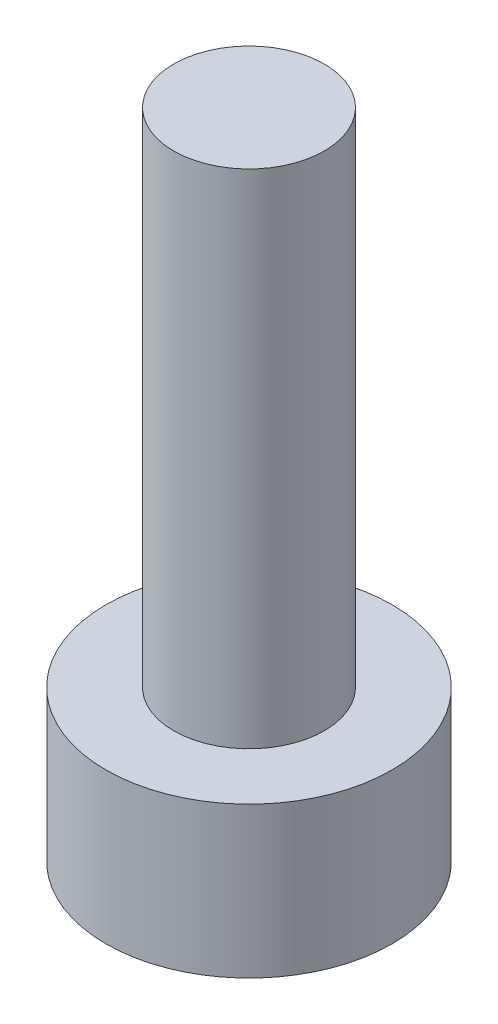
ISO-10303-21;
HEADER;
FILE_DESCRIPTION(('STEP AP214'),'2;1');
FILE_NAME('part.step','',(''),(''),'','','');
FILE_SCHEMA(('AUTOMOTIVE_DESIGN { 1 0 10303 214 1 1 1 1 }'));
ENDSEC;
DATA;
#1=APPLICATION_CONTEXT('core data for automotive mechanical design processes');
#2=APPLICATION_PROTOCOL_DEFINITION('international standard','automotive_design',2000,#1);
#3=PRODUCT_CONTEXT('',#1,'mechanical');
#4=PRODUCT('Part','Part','',(#3));
#5=PRODUCT_RELATED_PRODUCT_CATEGORY('part','',(#4));
#6=PRODUCT_DEFINITION_FORMATION('','',#4);
#7=PRODUCT_DEFINITION_CONTEXT('part definition',#1,'design');
#8=PRODUCT_DEFINITION('design','',#6,#7);
#9=PRODUCT_DEFINITION_SHAPE('','',#8);
#10=(LENGTH_UNIT() NAMED_UNIT(*) SI_UNIT(.MILLI.,.METRE.));
#11=(NAMED_UNIT(*) PLANE_ANGLE_UNIT() SI_UNIT($,.RADIAN.));
#12=(NAMED_UNIT(*) SI_UNIT($,.STERADIAN.) SOLID_ANGLE_UNIT());
#13=UNCERTAINTY_MEASURE_WITH_UNIT(LENGTH_MEASURE(1.E-05),#10,'distance_accuracy_value','');
#14=(GEOMETRIC_REPRESENTATION_CONTEXT(3) GLOBAL_UNCERTAINTY_ASSIGNED_CONTEXT((#13)) GLOBAL_UNIT_ASSIGNED_CONTEXT((#10,
#11,#12)) REPRESENTATION_CONTEXT('',''));
#15=CARTESIAN_POINT('',(0.,0.,0.));
#16=DIRECTION('',(0.,0.,1.));
#17=DIRECTION('',(1.,0.,0.));
#18=AXIS2_PLACEMENT_3D('',#15,#16,#17);
#19=CARTESIAN_POINT('',(0.,0.,0.));
#20=DIRECTION('',(0.,1.,0.));
#21=DIRECTION('',(0.,0.,1.));
#22=AXIS2_PLACEMENT_3D('',#19,#20,#21);
#23=PLANE('',#22);
#24=DIRECTION('',(0.866025403784439,0.,0.5));
#25=VECTOR('',#24,1.);
#26=CARTESIAN_POINT('',(0.,0.,-1.425));
#27=LINE('',#26,#25);
#28=CARTESIAN_POINT('',(0.,0.,-1.425));
#29=VERTEX_POINT('',#28);
#30=CARTESIAN_POINT('',(1.23408620039283,0.,-0.7125));
#31=VERTEX_POINT('',#30);
#32=EDGE_CURVE('E122',#29,#31,#27,.T.);
#33=ORIENTED_EDGE('',*,*,#32,.F.);
#34=DIRECTION('',(0.866025403784439,0.,-0.5));
#35=VECTOR('',#34,1.);
#36=CARTESIAN_POINT('',(-1.23408620039283,0.,-0.7125));
#37=LINE('',#36,#35);
#38=CARTESIAN_POINT('',(-1.23408620039283,0.,-0.7125));
#39=VERTEX_POINT('',#38);
#40=EDGE_CURVE('E48',#39,#29,#37,.T.);
#41=ORIENTED_EDGE('',*,*,#40,.F.);
#42=DIRECTION('',(0.,0.,-1.));
#43=VECTOR('',#42,1.);
#44=CARTESIAN_POINT('',(-1.23408620039283,0.,0.7125));
#45=LINE('',#44,#43);
#46=CARTESIAN_POINT('',(-1.23408620039283,0.,0.7125));
#47=VERTEX_POINT('',#46);
#48=EDGE_CURVE('E131',#47,#39,#45,.T.);
#49=ORIENTED_EDGE('',*,*,#48,.F.);
#50=DIRECTION('',(-0.866025403784439,0.,-0.5));
#51=VECTOR('',#50,1.);
#52=CARTESIAN_POINT('',(0.,0.,1.425));
#53=LINE('',#52,#51);
#54=CARTESIAN_POINT('',(0.,0.,1.425));
#55=VERTEX_POINT('',#54);
#56=EDGE_CURVE('E129',#55,#47,#53,.T.);
#57=ORIENTED_EDGE('',*,*,#56,.F.);
#58=DIRECTION('',(-0.866025403784439,0.,0.5));
#59=VECTOR('',#58,1.);
#60=CARTESIAN_POINT('',(1.23408620039282,0.,0.712500000000001));
#61=LINE('',#60,#59);
#62=CARTESIAN_POINT('',(1.23408620039282,0.,0.712500000000001));
#63=VERTEX_POINT('',#62);
#64=EDGE_CURVE('E96',#63,#55,#61,.T.);
#65=ORIENTED_EDGE('',*,*,#64,.F.);
#66=DIRECTION('',(0.,0.,1.));
#67=VECTOR('',#66,1.);
#68=CARTESIAN_POINT('',(1.23408620039283,0.,-0.7125));
#69=LINE('',#68,#67);
#70=EDGE_CURVE('E125',#31,#63,#69,.T.);
#71=ORIENTED_EDGE('',*,*,#70,.F.);
#72=EDGE_LOOP('',(#33,#41,#49,#57,#65,#71));
#73=FACE_BOUND('',#72,.T.);
#74=CARTESIAN_POINT('',(0.,0.,0.));
#75=DIRECTION('',(0.,1.,0.));
#76=DIRECTION('',(0.,0.,1.));
#77=AXIS2_PLACEMENT_3D('',#74,#75,#76);
#78=CIRCLE('',#77,2.85);
#79=CARTESIAN_POINT('',(0.,0.,2.85));
#80=VERTEX_POINT('',#79);
#81=EDGE_CURVE('E11',#80,#80,#78,.T.);
#82=ORIENTED_EDGE('',*,*,#81,.F.);
#83=EDGE_LOOP('',(#82));
#84=FACE_BOUND('',#83,.T.);
#85=ADVANCED_FACE('F34',(#73,#84),#23,.F.);
#86=CARTESIAN_POINT('',(0.,5.07932498206899,0.));
#87=DIRECTION('',(0.,1.,0.));
#88=DIRECTION('',(0.,0.,1.));
#89=AXIS2_PLACEMENT_3D('',#86,#87,#88);
#90=CYLINDRICAL_SURFACE('',#89,2.85);
#91=CARTESIAN_POINT('',(0.,3.,0.));
#92=DIRECTION('',(0.,1.,0.));
#93=DIRECTION('',(0.,0.,1.));
#94=AXIS2_PLACEMENT_3D('',#91,#92,#93);
#95=CIRCLE('',#94,2.85);
#96=CARTESIAN_POINT('',(0.,3.,2.85));
#97=VERTEX_POINT('',#96);
#98=EDGE_CURVE('E41',#97,#97,#95,.T.);
#99=ORIENTED_EDGE('',*,*,#98,.F.);
#100=EDGE_LOOP('',(#99));
#101=FACE_BOUND('',#100,.T.);
#102=ORIENTED_EDGE('',*,*,#81,.T.);
#103=EDGE_LOOP('',(#102));
#104=FACE_BOUND('',#103,.T.);
#105=ADVANCED_FACE('F150',(#101,#104),#90,.T.);
#106=CARTESIAN_POINT('',(2.85,3.,0.));
#107=DIRECTION('',(0.,-1.,0.));
#108=DIRECTION('',(0.,0.,-1.));
#109=AXIS2_PLACEMENT_3D('',#106,#107,#108);
#110=PLANE('',#109);
#111=CARTESIAN_POINT('',(0.,3.,0.));
#112=DIRECTION('',(0.,1.,0.));
#113=DIRECTION('',(0.,0.,1.));
#114=AXIS2_PLACEMENT_3D('',#111,#112,#113);
#115=CIRCLE('',#114,1.5);
#116=CARTESIAN_POINT('',(0.,3.,1.5));
#117=VERTEX_POINT('',#116);
#118=EDGE_CURVE('E143',#117,#117,#115,.T.);
#119=ORIENTED_EDGE('',*,*,#118,.F.);
#120=EDGE_LOOP('',(#119));
#121=FACE_BOUND('',#120,.T.);
#122=ORIENTED_EDGE('',*,*,#98,.T.);
#123=EDGE_LOOP('',(#122));
#124=FACE_BOUND('',#123,.T.);
#125=ADVANCED_FACE('F148',(#121,#124),#110,.F.);
#126=CARTESIAN_POINT('',(0.,5.07932498206899,0.));
#127=DIRECTION('',(0.,1.,0.));
#128=DIRECTION('',(0.,0.,1.));
#129=AXIS2_PLACEMENT_3D('',#126,#127,#128);
#130=CYLINDRICAL_SURFACE('',#129,1.5);
#131=CARTESIAN_POINT('',(0.,13.,0.));
#132=DIRECTION('',(0.,1.,0.));
#133=DIRECTION('',(0.,0.,1.));
#134=AXIS2_PLACEMENT_3D('',#131,#132,#133);
#135=CIRCLE('',#134,1.5);
#136=CARTESIAN_POINT('',(0.,13.,1.5));
#137=VERTEX_POINT('',#136);
#138=EDGE_CURVE('E135',#137,#137,#135,.T.);
#139=ORIENTED_EDGE('',*,*,#138,.F.);
#140=EDGE_LOOP('',(#139));
#141=FACE_BOUND('',#140,.T.);
#142=ORIENTED_EDGE('',*,*,#118,.T.);
#143=EDGE_LOOP('',(#142));
#144=FACE_BOUND('',#143,.T.);
#145=ADVANCED_FACE('F175',(#141,#144),#130,.T.);
#146=CARTESIAN_POINT('',(1.5,13.,0.));
#147=DIRECTION('',(0.,-1.,0.));
#148=DIRECTION('',(0.,0.,-1.));
#149=AXIS2_PLACEMENT_3D('',#146,#147,#148);
#150=PLANE('',#149);
#151=ORIENTED_EDGE('',*,*,#138,.T.);
#152=EDGE_LOOP('',(#151));
#153=FACE_BOUND('',#152,.T.);
#154=ADVANCED_FACE('F168',(#153),#150,.F.);
#155=CARTESIAN_POINT('',(-1.23408620039283,1.5,-0.7125));
#156=DIRECTION('',(-0.5,0.,-0.866025403784439));
#157=DIRECTION('',(-0.866025403784439,0.,0.5));
#158=AXIS2_PLACEMENT_3D('',#155,#156,#157);
#159=PLANE('',#158);
#160=ORIENTED_EDGE('',*,*,#40,.T.);
#161=DIRECTION('',(0.,-1.,0.));
#162=VECTOR('',#161,1.);
#163=CARTESIAN_POINT('',(0.,1.5,-1.425));
#164=LINE('',#163,#162);
#165=CARTESIAN_POINT('',(0.,1.5,-1.425));
#166=VERTEX_POINT('',#165);
#167=EDGE_CURVE('E78',#166,#29,#164,.T.);
#168=ORIENTED_EDGE('',*,*,#167,.F.);
#169=DIRECTION('',(0.866025403784439,0.,-0.5));
#170=VECTOR('',#169,1.);
#171=CARTESIAN_POINT('',(-1.23408620039283,1.5,-0.7125));
#172=LINE('',#171,#170);
#173=CARTESIAN_POINT('',(-1.23408620039283,1.5,-0.7125));
#174=VERTEX_POINT('',#173);
#175=EDGE_CURVE('E133',#174,#166,#172,.T.);
#176=ORIENTED_EDGE('',*,*,#175,.F.);
#177=DIRECTION('',(0.,-1.,0.));
#178=VECTOR('',#177,1.);
#179=CARTESIAN_POINT('',(-1.23408620039283,1.5,-0.7125));
#180=LINE('',#179,#178);
#181=EDGE_CURVE('E56',#174,#39,#180,.T.);
#182=ORIENTED_EDGE('',*,*,#181,.T.);
#183=EDGE_LOOP('',(#160,#168,#176,#182));
#184=FACE_BOUND('',#183,.T.);
#185=ADVANCED_FACE('F165',(#184),#159,.F.);
#186=CARTESIAN_POINT('',(-1.23408620039283,1.5,0.7125));
#187=DIRECTION('',(-1.,0.,0.));
#188=DIRECTION('',(0.,0.,1.));
#189=AXIS2_PLACEMENT_3D('',#186,#187,#188);
#190=PLANE('',#189);
#191=ORIENTED_EDGE('',*,*,#48,.T.);
#192=ORIENTED_EDGE('',*,*,#181,.F.);
#193=DIRECTION('',(0.,0.,-1.));
#194=VECTOR('',#193,1.);
#195=CARTESIAN_POINT('',(-1.23408620039283,1.5,0.7125));
#196=LINE('',#195,#194);
#197=CARTESIAN_POINT('',(-1.23408620039283,1.5,0.7125));
#198=VERTEX_POINT('',#197);
#199=EDGE_CURVE('E108',#198,#174,#196,.T.);
#200=ORIENTED_EDGE('',*,*,#199,.F.);
#201=DIRECTION('',(0.,-1.,0.));
#202=VECTOR('',#201,1.);
#203=CARTESIAN_POINT('',(-1.23408620039283,1.5,0.7125));
#204=LINE('',#203,#202);
#205=EDGE_CURVE('E100',#198,#47,#204,.T.);
#206=ORIENTED_EDGE('',*,*,#205,.T.);
#207=EDGE_LOOP('',(#191,#192,#200,#206));
#208=FACE_BOUND('',#207,.T.);
#209=ADVANCED_FACE('F167',(#208),#190,.F.);
#210=CARTESIAN_POINT('',(0.,1.5,1.425));
#211=DIRECTION('',(-0.5,0.,0.866025403784438));
#212=DIRECTION('',(0.866025403784439,0.,0.5));
#213=AXIS2_PLACEMENT_3D('',#210,#211,#212);
#214=PLANE('',#213);
#215=ORIENTED_EDGE('',*,*,#56,.T.);
#216=ORIENTED_EDGE('',*,*,#205,.F.);
#217=DIRECTION('',(-0.866025403784439,0.,-0.5));
#218=VECTOR('',#217,1.);
#219=CARTESIAN_POINT('',(0.,1.5,1.425));
#220=LINE('',#219,#218);
#221=CARTESIAN_POINT('',(0.,1.5,1.425));
#222=VERTEX_POINT('',#221);
#223=EDGE_CURVE('E104',#222,#198,#220,.T.);
#224=ORIENTED_EDGE('',*,*,#223,.F.);
#225=DIRECTION('',(0.,-1.,0.));
#226=VECTOR('',#225,1.);
#227=CARTESIAN_POINT('',(0.,1.5,1.425));
#228=LINE('',#227,#226);
#229=EDGE_CURVE('E89',#222,#55,#228,.T.);
#230=ORIENTED_EDGE('',*,*,#229,.T.);
#231=EDGE_LOOP('',(#215,#216,#224,#230));
#232=FACE_BOUND('',#231,.T.);
#233=ADVANCED_FACE('F105',(#232),#214,.F.);
#234=CARTESIAN_POINT('',(1.23408620039282,1.5,0.712500000000001));
#235=DIRECTION('',(0.5,0.,0.866025403784439));
#236=DIRECTION('',(0.866025403784439,0.,-0.5));
#237=AXIS2_PLACEMENT_3D('',#234,#235,#236);
#238=PLANE('',#237);
#239=ORIENTED_EDGE('',*,*,#64,.T.);
#240=ORIENTED_EDGE('',*,*,#229,.F.);
#241=DIRECTION('',(-0.866025403784439,0.,0.5));
#242=VECTOR('',#241,1.);
#243=CARTESIAN_POINT('',(1.23408620039282,1.5,0.712500000000001));
#244=LINE('',#243,#242);
#245=CARTESIAN_POINT('',(1.23408620039282,1.5,0.712500000000001));
#246=VERTEX_POINT('',#245);
#247=EDGE_CURVE('E93',#246,#222,#244,.T.);
#248=ORIENTED_EDGE('',*,*,#247,.F.);
#249=DIRECTION('',(0.,-1.,0.));
#250=VECTOR('',#249,1.);
#251=CARTESIAN_POINT('',(1.23408620039282,1.5,0.712500000000001));
#252=LINE('',#251,#250);
#253=EDGE_CURVE('E101',#246,#63,#252,.T.);
#254=ORIENTED_EDGE('',*,*,#253,.T.);
#255=EDGE_LOOP('',(#239,#240,#248,#254));
#256=FACE_BOUND('',#255,.T.);
#257=ADVANCED_FACE('F91',(#256),#238,.F.);
#258=CARTESIAN_POINT('',(1.23408620039283,1.5,-0.7125));
#259=DIRECTION('',(1.,0.,0.));
#260=DIRECTION('',(0.,0.,-1.));
#261=AXIS2_PLACEMENT_3D('',#258,#259,#260);
#262=PLANE('',#261);
#263=ORIENTED_EDGE('',*,*,#70,.T.);
#264=ORIENTED_EDGE('',*,*,#253,.F.);
#265=DIRECTION('',(0.,0.,1.));
#266=VECTOR('',#265,1.);
#267=CARTESIAN_POINT('',(1.23408620039283,1.5,-0.7125));
#268=LINE('',#267,#266);
#269=CARTESIAN_POINT('',(1.23408620039283,1.5,-0.7125));
#270=VERTEX_POINT('',#269);
#271=EDGE_CURVE('E114',#270,#246,#268,.T.);
#272=ORIENTED_EDGE('',*,*,#271,.F.);
#273=DIRECTION('',(0.,-1.,0.));
#274=VECTOR('',#273,1.);
#275=CARTESIAN_POINT('',(1.23408620039283,1.5,-0.7125));
#276=LINE('',#275,#274);
#277=EDGE_CURVE('E138',#270,#31,#276,.T.);
#278=ORIENTED_EDGE('',*,*,#277,.T.);
#279=EDGE_LOOP('',(#263,#264,#272,#278));
#280=FACE_BOUND('',#279,.T.);
#281=ADVANCED_FACE('F232',(#280),#262,.F.);
#282=CARTESIAN_POINT('',(0.,1.5,-1.425));
#283=DIRECTION('',(0.5,0.,-0.866025403784439));
#284=DIRECTION('',(-0.866025403784439,0.,-0.5));
#285=AXIS2_PLACEMENT_3D('',#282,#283,#284);
#286=PLANE('',#285);
#287=ORIENTED_EDGE('',*,*,#32,.T.);
#288=ORIENTED_EDGE('',*,*,#277,.F.);
#289=DIRECTION('',(0.866025403784439,0.,0.5));
#290=VECTOR('',#289,1.);
#291=CARTESIAN_POINT('',(0.,1.5,-1.425));
#292=LINE('',#291,#290);
#293=EDGE_CURVE('E116',#166,#270,#292,.T.);
#294=ORIENTED_EDGE('',*,*,#293,.F.);
#295=ORIENTED_EDGE('',*,*,#167,.T.);
#296=EDGE_LOOP('',(#287,#288,#294,#295));
#297=FACE_BOUND('',#296,.T.);
#298=ADVANCED_FACE('F163',(#297),#286,.F.);
#299=CARTESIAN_POINT('',(0.,1.5,0.));
#300=DIRECTION('',(0.,-1.,0.));
#301=DIRECTION('',(0.,0.,-1.));
#302=AXIS2_PLACEMENT_3D('',#299,#300,#301);
#303=PLANE('',#302);
#304=ORIENTED_EDGE('',*,*,#175,.T.);
#305=ORIENTED_EDGE('',*,*,#293,.T.);
#306=ORIENTED_EDGE('',*,*,#271,.T.);
#307=ORIENTED_EDGE('',*,*,#247,.T.);
#308=ORIENTED_EDGE('',*,*,#223,.T.);
#309=ORIENTED_EDGE('',*,*,#199,.T.);
#310=EDGE_LOOP('',(#304,#305,#306,#307,#308,#309));
#311=FACE_BOUND('',#310,.T.);
#312=ADVANCED_FACE('F111',(#311),#303,.T.);
#313=CLOSED_SHELL('',(#85,#105,#125,#145,#154,#185,#209,#233,#257,#281,#298,#312));
#314=MANIFOLD_SOLID_BREP('B2',#313);
#315=ADVANCED_BREP_SHAPE_REPRESENTATION('',(#18,#314),#14);
#316=SHAPE_DEFINITION_REPRESENTATION(#9,#315);
ENDSEC;
END-ISO-10303-21;
